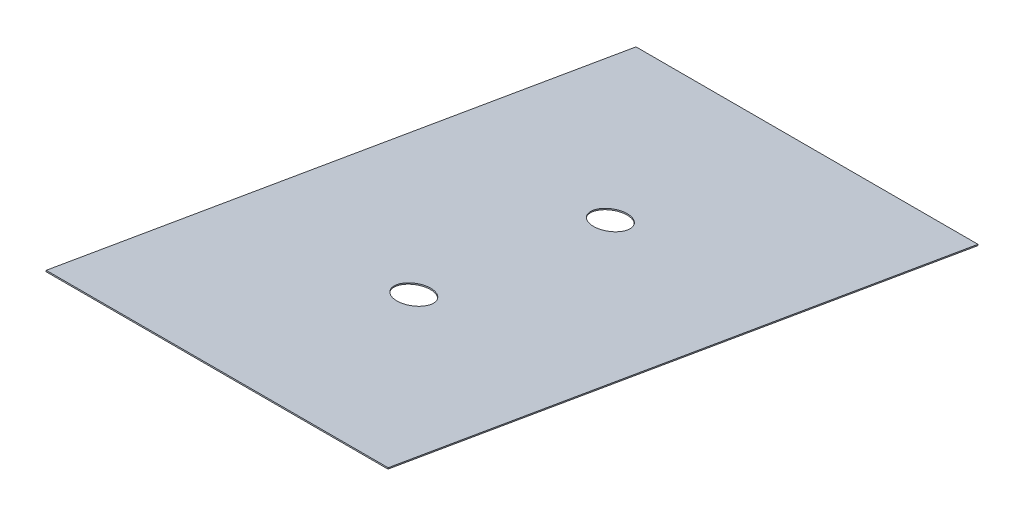
ISO-10303-21;
HEADER;
FILE_DESCRIPTION(('STEP AP214'),'2;1');
FILE_NAME('part.step','',(''),(''),'','','');
FILE_SCHEMA(('AUTOMOTIVE_DESIGN { 1 0 10303 214 1 1 1 1 }'));
ENDSEC;
DATA;
#1=APPLICATION_CONTEXT('core data for automotive mechanical design processes');
#2=APPLICATION_PROTOCOL_DEFINITION('international standard','automotive_design',2000,#1);
#3=PRODUCT_CONTEXT('',#1,'mechanical');
#4=PRODUCT('Part','Part','',(#3));
#5=PRODUCT_RELATED_PRODUCT_CATEGORY('part','',(#4));
#6=PRODUCT_DEFINITION_FORMATION('','',#4);
#7=PRODUCT_DEFINITION_CONTEXT('part definition',#1,'design');
#8=PRODUCT_DEFINITION('design','',#6,#7);
#9=PRODUCT_DEFINITION_SHAPE('','',#8);
#10=(LENGTH_UNIT() NAMED_UNIT(*) SI_UNIT(.MILLI.,.METRE.));
#11=(NAMED_UNIT(*) PLANE_ANGLE_UNIT() SI_UNIT($,.RADIAN.));
#12=(NAMED_UNIT(*) SI_UNIT($,.STERADIAN.) SOLID_ANGLE_UNIT());
#13=UNCERTAINTY_MEASURE_WITH_UNIT(LENGTH_MEASURE(1.E-05),#10,'distance_accuracy_value','');
#14=(GEOMETRIC_REPRESENTATION_CONTEXT(3) GLOBAL_UNCERTAINTY_ASSIGNED_CONTEXT((#13)) GLOBAL_UNIT_ASSIGNED_CONTEXT((#10,
#11,#12)) REPRESENTATION_CONTEXT('',''));
#15=CARTESIAN_POINT('',(0.,0.,0.));
#16=DIRECTION('',(0.,0.,1.));
#17=DIRECTION('',(1.,0.,0.));
#18=AXIS2_PLACEMENT_3D('',#15,#16,#17);
#19=CARTESIAN_POINT('',(0.,4.74088764054153,38.8933810843133));
#20=DIRECTION('',(-1.,0.,0.));
#21=DIRECTION('',(0.,-0.169439179137223,-0.985540645825074));
#22=AXIS2_PLACEMENT_3D('',#19,#20,#21);
#23=PLANE('',#22);
#24=DIRECTION('',(0.,-0.985540645825074,0.169439179137223));
#25=VECTOR('',#24,1.);
#26=CARTESIAN_POINT('',(0.,4.74088764054153,38.8933810843133));
#27=LINE('',#26,#25);
#28=CARTESIAN_POINT('',(0.,4.83944170512403,38.8764371663996));
#29=VERTEX_POINT('',#28);
#30=CARTESIAN_POINT('',(0.,4.74088764054153,38.8933810843133));
#31=VERTEX_POINT('',#30);
#32=EDGE_CURVE('E11',#29,#31,#27,.T.);
#33=ORIENTED_EDGE('',*,*,#32,.F.);
#34=DIRECTION('',(0.,-0.169439179137223,-0.985540645825074));
#35=VECTOR('',#34,1.);
#36=CARTESIAN_POINT('',(0.,4.83944170512403,38.8764371663996));
#37=LINE('',#36,#35);
#38=CARTESIAN_POINT('',(0.,-4.05611519958016,-12.8644467394168));
#39=VERTEX_POINT('',#38);
#40=EDGE_CURVE('E88',#29,#39,#37,.T.);
#41=ORIENTED_EDGE('',*,*,#40,.T.);
#42=DIRECTION('',(0.,-0.985540645825074,0.169439179137223));
#43=VECTOR('',#42,1.);
#44=CARTESIAN_POINT('',(0.,-4.15466926416267,-12.8475028215031));
#45=LINE('',#44,#43);
#46=CARTESIAN_POINT('',(0.,-4.15466926416267,-12.8475028215031));
#47=VERTEX_POINT('',#46);
#48=EDGE_CURVE('E43',#39,#47,#45,.T.);
#49=ORIENTED_EDGE('',*,*,#48,.T.);
#50=DIRECTION('',(0.,-0.169439179137223,-0.985540645825074));
#51=VECTOR('',#50,1.);
#52=CARTESIAN_POINT('',(0.,4.74088764054153,38.8933810843133));
#53=LINE('',#52,#51);
#54=EDGE_CURVE('E105',#31,#47,#53,.T.);
#55=ORIENTED_EDGE('',*,*,#54,.F.);
#56=EDGE_LOOP('',(#33,#41,#49,#55));
#57=FACE_BOUND('',#56,.T.);
#58=ADVANCED_FACE('F33',(#57),#23,.T.);
#59=CARTESIAN_POINT('',(0.,-4.15466926416267,-12.8475028215031));
#60=DIRECTION('',(0.,-0.169439179137223,-0.985540645825074));
#61=DIRECTION('',(1.,0.,0.));
#62=AXIS2_PLACEMENT_3D('',#59,#60,#61);
#63=PLANE('',#62);
#64=ORIENTED_EDGE('',*,*,#48,.F.);
#65=DIRECTION('',(1.,0.,0.));
#66=VECTOR('',#65,1.);
#67=CARTESIAN_POINT('',(0.,-4.05611519958016,-12.8644467394168));
#68=LINE('',#67,#66);
#69=CARTESIAN_POINT('',(30.,-4.05611519958016,-12.8644467394168));
#70=VERTEX_POINT('',#69);
#71=EDGE_CURVE('E99',#39,#70,#68,.T.);
#72=ORIENTED_EDGE('',*,*,#71,.T.);
#73=DIRECTION('',(0.,-0.985540645825074,0.169439179137223));
#74=VECTOR('',#73,1.);
#75=CARTESIAN_POINT('',(30.,-4.15466926416267,-12.8475028215031));
#76=LINE('',#75,#74);
#77=CARTESIAN_POINT('',(30.,-4.15466926416267,-12.8475028215031));
#78=VERTEX_POINT('',#77);
#79=EDGE_CURVE('E51',#70,#78,#76,.T.);
#80=ORIENTED_EDGE('',*,*,#79,.T.);
#81=DIRECTION('',(1.,0.,0.));
#82=VECTOR('',#81,1.);
#83=CARTESIAN_POINT('',(0.,-4.15466926416267,-12.8475028215031));
#84=LINE('',#83,#82);
#85=EDGE_CURVE('E82',#47,#78,#84,.T.);
#86=ORIENTED_EDGE('',*,*,#85,.F.);
#87=EDGE_LOOP('',(#64,#72,#80,#86));
#88=FACE_BOUND('',#87,.T.);
#89=ADVANCED_FACE('F109',(#88),#63,.T.);
#90=CARTESIAN_POINT('',(30.,4.74088764054153,38.8933810843133));
#91=DIRECTION('',(-1.,0.,0.));
#92=DIRECTION('',(0.,-0.169439179137223,-0.985540645825074));
#93=AXIS2_PLACEMENT_3D('',#90,#91,#92);
#94=PLANE('',#93);
#95=ORIENTED_EDGE('',*,*,#79,.F.);
#96=DIRECTION('',(0.,-0.169439179137223,-0.985540645825074));
#97=VECTOR('',#96,1.);
#98=CARTESIAN_POINT('',(30.,4.83944170512403,38.8764371663996));
#99=LINE('',#98,#97);
#100=CARTESIAN_POINT('',(30.,4.83944170512403,38.8764371663996));
#101=VERTEX_POINT('',#100);
#102=EDGE_CURVE('E87',#101,#70,#99,.T.);
#103=ORIENTED_EDGE('',*,*,#102,.F.);
#104=DIRECTION('',(0.,-0.985540645825074,0.169439179137223));
#105=VECTOR('',#104,1.);
#106=CARTESIAN_POINT('',(30.,4.74088764054153,38.8933810843133));
#107=LINE('',#106,#105);
#108=CARTESIAN_POINT('',(30.,4.74088764054153,38.8933810843133));
#109=VERTEX_POINT('',#108);
#110=EDGE_CURVE('E37',#101,#109,#107,.T.);
#111=ORIENTED_EDGE('',*,*,#110,.T.);
#112=DIRECTION('',(0.,-0.169439179137223,-0.985540645825074));
#113=VECTOR('',#112,1.);
#114=CARTESIAN_POINT('',(30.,4.74088764054153,38.8933810843133));
#115=LINE('',#114,#113);
#116=EDGE_CURVE('E101',#109,#78,#115,.T.);
#117=ORIENTED_EDGE('',*,*,#116,.T.);
#118=EDGE_LOOP('',(#95,#103,#111,#117));
#119=FACE_BOUND('',#118,.T.);
#120=ADVANCED_FACE('F90',(#119),#94,.F.);
#121=CARTESIAN_POINT('',(0.,4.74088764054153,38.8933810843133));
#122=DIRECTION('',(0.,-0.169439179137223,-0.985540645825074));
#123=DIRECTION('',(1.,0.,0.));
#124=AXIS2_PLACEMENT_3D('',#121,#122,#123);
#125=PLANE('',#124);
#126=DIRECTION('',(1.,0.,0.));
#127=VECTOR('',#126,1.);
#128=CARTESIAN_POINT('',(0.,4.83944170512403,38.8764371663996));
#129=LINE('',#128,#127);
#130=EDGE_CURVE('E76',#29,#101,#129,.T.);
#131=ORIENTED_EDGE('',*,*,#130,.F.);
#132=ORIENTED_EDGE('',*,*,#32,.T.);
#133=DIRECTION('',(1.,0.,0.));
#134=VECTOR('',#133,1.);
#135=CARTESIAN_POINT('',(0.,4.74088764054153,38.8933810843133));
#136=LINE('',#135,#134);
#137=EDGE_CURVE('E78',#31,#109,#136,.T.);
#138=ORIENTED_EDGE('',*,*,#137,.T.);
#139=ORIENTED_EDGE('',*,*,#110,.F.);
#140=EDGE_LOOP('',(#131,#132,#138,#139));
#141=FACE_BOUND('',#140,.T.);
#142=ADVANCED_FACE('F35',(#141),#125,.F.);
#143=CARTESIAN_POINT('',(0.,4.74088764054153,38.8933810843133));
#144=DIRECTION('',(0.,-0.985540645825074,0.169439179137223));
#145=DIRECTION('',(0.,-0.169439179137223,-0.985540645825074));
#146=AXIS2_PLACEMENT_3D('',#143,#144,#145);
#147=PLANE('',#146);
#148=CARTESIAN_POINT('',(15.,-1.18948362926127,4.39945848043573));
#149=DIRECTION('',(0.,-0.985540645825074,0.169439179137223));
#150=DIRECTION('',(0.,-0.169439179137223,-0.985540645825074));
#151=AXIS2_PLACEMENT_3D('',#148,#149,#150);
#152=CIRCLE('',#151,1.5);
#153=CARTESIAN_POINT('',(15.,-1.44364239796711,2.92114751169812));
#154=VERTEX_POINT('',#153);
#155=EDGE_CURVE('E94',#154,#154,#152,.F.);
#156=ORIENTED_EDGE('',*,*,#155,.T.);
#157=EDGE_LOOP('',(#156));
#158=FACE_BOUND('',#157,.T.);
#159=CARTESIAN_POINT('',(15.,1.77570200564013,21.6464197823745));
#160=DIRECTION('',(0.,-0.985540645825074,0.169439179137223));
#161=DIRECTION('',(0.,-0.169439179137223,-0.985540645825074));
#162=AXIS2_PLACEMENT_3D('',#159,#160,#161);
#163=CIRCLE('',#162,1.5);
#164=CARTESIAN_POINT('',(15.,1.5215432369343,20.1681088136369));
#165=VERTEX_POINT('',#164);
#166=EDGE_CURVE('E113',#165,#165,#163,.F.);
#167=ORIENTED_EDGE('',*,*,#166,.T.);
#168=EDGE_LOOP('',(#167));
#169=FACE_BOUND('',#168,.T.);
#170=ORIENTED_EDGE('',*,*,#116,.F.);
#171=ORIENTED_EDGE('',*,*,#137,.F.);
#172=ORIENTED_EDGE('',*,*,#54,.T.);
#173=ORIENTED_EDGE('',*,*,#85,.T.);
#174=EDGE_LOOP('',(#170,#171,#172,#173));
#175=FACE_BOUND('',#174,.T.);
#176=ADVANCED_FACE('F108',(#158,#169,#175),#147,.T.);
#177=CARTESIAN_POINT('',(0.,4.83944170512403,38.8764371663996));
#178=DIRECTION('',(0.,-0.985540645825074,0.169439179137223));
#179=DIRECTION('',(0.,-0.169439179137223,-0.985540645825074));
#180=AXIS2_PLACEMENT_3D('',#177,#178,#179);
#181=PLANE('',#180);
#182=CARTESIAN_POINT('',(15.,-1.09092956467875,4.382514562522));
#183=DIRECTION('',(0.,0.985540645825073,-0.169439179137227));
#184=DIRECTION('',(0.,0.169439179137227,0.985540645825073));
#185=AXIS2_PLACEMENT_3D('',#182,#183,#184);
#186=CIRCLE('',#185,1.5);
#187=CARTESIAN_POINT('',(15.,-0.836770795972905,5.86082553125961));
#188=VERTEX_POINT('',#187);
#189=EDGE_CURVE('E91',#188,#188,#186,.T.);
#190=ORIENTED_EDGE('',*,*,#189,.F.);
#191=EDGE_LOOP('',(#190));
#192=FACE_BOUND('',#191,.T.);
#193=CARTESIAN_POINT('',(15.,1.87425607022273,21.6294758644608));
#194=DIRECTION('',(0.,0.985540645825073,-0.169439179137227));
#195=DIRECTION('',(0.,0.169439179137227,0.985540645825073));
#196=AXIS2_PLACEMENT_3D('',#193,#194,#195);
#197=CIRCLE('',#196,1.5);
#198=CARTESIAN_POINT('',(15.,2.12841483892857,23.1077868331984));
#199=VERTEX_POINT('',#198);
#200=EDGE_CURVE('E116',#199,#199,#197,.T.);
#201=ORIENTED_EDGE('',*,*,#200,.F.);
#202=EDGE_LOOP('',(#201));
#203=FACE_BOUND('',#202,.T.);
#204=ORIENTED_EDGE('',*,*,#102,.T.);
#205=ORIENTED_EDGE('',*,*,#71,.F.);
#206=ORIENTED_EDGE('',*,*,#40,.F.);
#207=ORIENTED_EDGE('',*,*,#130,.T.);
#208=EDGE_LOOP('',(#204,#205,#206,#207));
#209=FACE_BOUND('',#208,.T.);
#210=ADVANCED_FACE('F85',(#192,#203,#209),#181,.F.);
#211=CARTESIAN_POINT('',(15.,-37.218334918102,28.3504736796892));
#212=DIRECTION('',(0.,0.985540645825073,-0.169439179137227));
#213=DIRECTION('',(0.,0.169439179137227,0.985540645825073));
#214=AXIS2_PLACEMENT_3D('',#211,#212,#213);
#215=CYLINDRICAL_SURFACE('',#214,1.5);
#216=ORIENTED_EDGE('',*,*,#166,.F.);
#217=EDGE_LOOP('',(#216));
#218=FACE_BOUND('',#217,.T.);
#219=ORIENTED_EDGE('',*,*,#200,.T.);
#220=EDGE_LOOP('',(#219));
#221=FACE_BOUND('',#220,.T.);
#222=ADVANCED_FACE('F127',(#218,#221),#215,.F.);
#223=CARTESIAN_POINT('',(15.,-40.1835205530035,11.1035123777504));
#224=DIRECTION('',(0.,0.985540645825073,-0.169439179137227));
#225=DIRECTION('',(0.,0.169439179137227,0.985540645825073));
#226=AXIS2_PLACEMENT_3D('',#223,#224,#225);
#227=CYLINDRICAL_SURFACE('',#226,1.5);
#228=ORIENTED_EDGE('',*,*,#155,.F.);
#229=EDGE_LOOP('',(#228));
#230=FACE_BOUND('',#229,.T.);
#231=ORIENTED_EDGE('',*,*,#189,.T.);
#232=EDGE_LOOP('',(#231));
#233=FACE_BOUND('',#232,.T.);
#234=ADVANCED_FACE('F124',(#230,#233),#227,.F.);
#235=CLOSED_SHELL('',(#58,#89,#120,#142,#176,#210,#222,#234));
#236=MANIFOLD_SOLID_BREP('B2',#235);
#237=ADVANCED_BREP_SHAPE_REPRESENTATION('',(#18,#236),#14);
#238=SHAPE_DEFINITION_REPRESENTATION(#9,#237);
ENDSEC;
END-ISO-10303-21;
